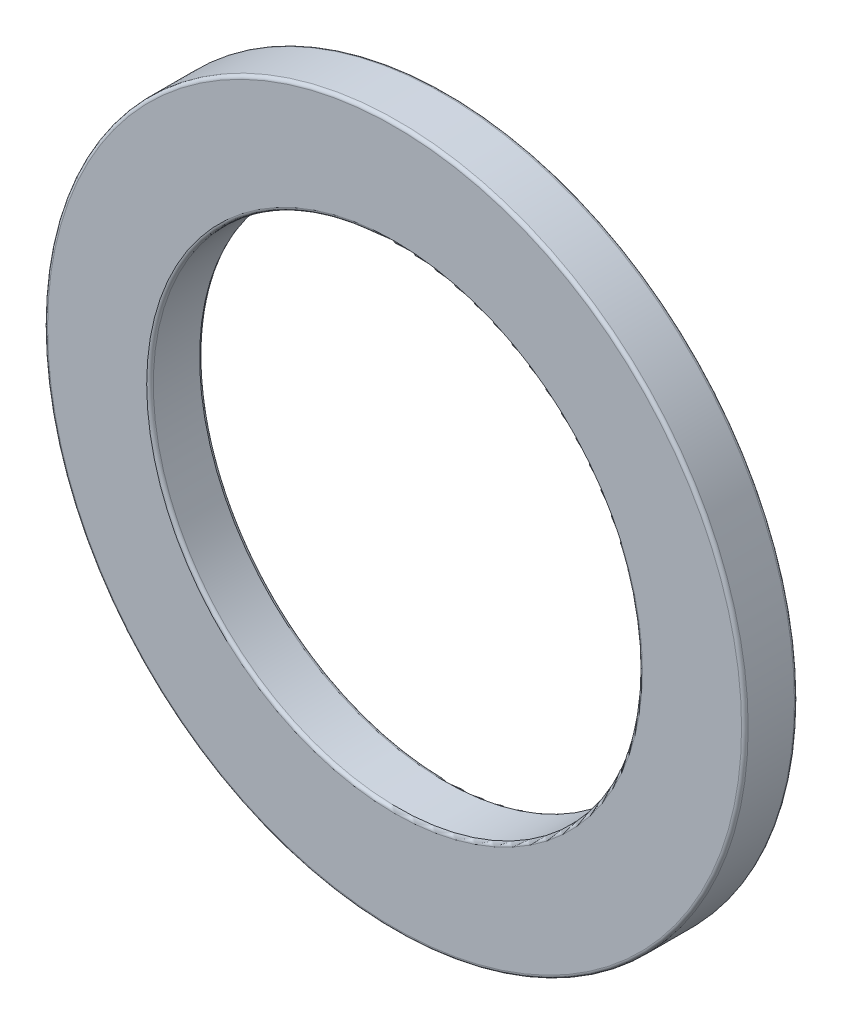
ISO-10303-21;
HEADER;
FILE_DESCRIPTION(('STEP AP214'),'2;1');
FILE_NAME('part.step','',(''),(''),'','','');
FILE_SCHEMA(('AUTOMOTIVE_DESIGN { 1 0 10303 214 1 1 1 1 }'));
ENDSEC;
DATA;
#1=APPLICATION_CONTEXT('core data for automotive mechanical design processes');
#2=APPLICATION_PROTOCOL_DEFINITION('international standard','automotive_design',2000,#1);
#3=PRODUCT_CONTEXT('',#1,'mechanical');
#4=PRODUCT('Part','Part','',(#3));
#5=PRODUCT_RELATED_PRODUCT_CATEGORY('part','',(#4));
#6=PRODUCT_DEFINITION_FORMATION('','',#4);
#7=PRODUCT_DEFINITION_CONTEXT('part definition',#1,'design');
#8=PRODUCT_DEFINITION('design','',#6,#7);
#9=PRODUCT_DEFINITION_SHAPE('','',#8);
#10=(LENGTH_UNIT() NAMED_UNIT(*) SI_UNIT(.MILLI.,.METRE.));
#11=(NAMED_UNIT(*) PLANE_ANGLE_UNIT() SI_UNIT($,.RADIAN.));
#12=(NAMED_UNIT(*) SI_UNIT($,.STERADIAN.) SOLID_ANGLE_UNIT());
#13=UNCERTAINTY_MEASURE_WITH_UNIT(LENGTH_MEASURE(1.E-05),#10,'distance_accuracy_value','');
#14=(GEOMETRIC_REPRESENTATION_CONTEXT(3) GLOBAL_UNCERTAINTY_ASSIGNED_CONTEXT((#13)) GLOBAL_UNIT_ASSIGNED_CONTEXT((#10,
#11,#12)) REPRESENTATION_CONTEXT('',''));
#15=CARTESIAN_POINT('',(0.,0.,0.));
#16=DIRECTION('',(0.,0.,1.));
#17=DIRECTION('',(1.,0.,0.));
#18=AXIS2_PLACEMENT_3D('',#15,#16,#17);
#19=CARTESIAN_POINT('',(0.,0.,8.));
#20=DIRECTION('',(0.,0.,1.));
#21=DIRECTION('',(1.,0.,0.));
#22=AXIS2_PLACEMENT_3D('',#19,#20,#21);
#23=PLANE('',#22);
#24=CARTESIAN_POINT('',(0.,0.,8.));
#25=DIRECTION('',(0.,0.,1.));
#26=DIRECTION('',(1.,0.,0.));
#27=AXIS2_PLACEMENT_3D('',#24,#25,#26);
#28=CIRCLE('',#27,37.5);
#29=CARTESIAN_POINT('',(37.5,0.,8.));
#30=VERTEX_POINT('',#29);
#31=EDGE_CURVE('E46',#30,#30,#28,.F.);
#32=ORIENTED_EDGE('',*,*,#31,.T.);
#33=EDGE_LOOP('',(#32));
#34=FACE_BOUND('',#33,.T.);
#35=CARTESIAN_POINT('',(0.,0.,8.));
#36=DIRECTION('',(0.,0.,1.));
#37=DIRECTION('',(1.,0.,0.));
#38=AXIS2_PLACEMENT_3D('',#35,#36,#37);
#39=CIRCLE('',#38,52.5);
#40=CARTESIAN_POINT('',(52.5,0.,8.));
#41=VERTEX_POINT('',#40);
#42=EDGE_CURVE('E50',#41,#41,#39,.T.);
#43=ORIENTED_EDGE('',*,*,#42,.T.);
#44=EDGE_LOOP('',(#43));
#45=FACE_BOUND('',#44,.T.);
#46=ADVANCED_FACE('F35',(#34,#45),#23,.T.);
#47=CARTESIAN_POINT('',(0.,0.,0.));
#48=DIRECTION('',(0.,0.,1.));
#49=DIRECTION('',(1.,0.,0.));
#50=AXIS2_PLACEMENT_3D('',#47,#48,#49);
#51=PLANE('',#50);
#52=CARTESIAN_POINT('',(0.,0.,0.));
#53=DIRECTION('',(0.,0.,1.));
#54=DIRECTION('',(1.,0.,0.));
#55=AXIS2_PLACEMENT_3D('',#52,#53,#54);
#56=CIRCLE('',#55,37.5);
#57=CARTESIAN_POINT('',(37.5,0.,0.));
#58=VERTEX_POINT('',#57);
#59=EDGE_CURVE('E61',#58,#58,#56,.T.);
#60=ORIENTED_EDGE('',*,*,#59,.T.);
#61=EDGE_LOOP('',(#60));
#62=FACE_BOUND('',#61,.T.);
#63=CARTESIAN_POINT('',(0.,0.,0.));
#64=DIRECTION('',(0.,0.,1.));
#65=DIRECTION('',(1.,0.,0.));
#66=AXIS2_PLACEMENT_3D('',#63,#64,#65);
#67=CIRCLE('',#66,52.5);
#68=CARTESIAN_POINT('',(52.5,0.,0.));
#69=VERTEX_POINT('',#68);
#70=EDGE_CURVE('E64',#69,#69,#67,.F.);
#71=ORIENTED_EDGE('',*,*,#70,.T.);
#72=EDGE_LOOP('',(#71));
#73=FACE_BOUND('',#72,.T.);
#74=ADVANCED_FACE('F68',(#62,#73),#51,.F.);
#75=CARTESIAN_POINT('',(0.,0.,8.));
#76=DIRECTION('',(0.,0.,-1.));
#77=DIRECTION('',(-1.,0.,0.));
#78=AXIS2_PLACEMENT_3D('',#75,#76,#77);
#79=CYLINDRICAL_SURFACE('',#78,53.);
#80=CARTESIAN_POINT('',(0.,0.,0.5));
#81=DIRECTION('',(0.,0.,1.));
#82=DIRECTION('',(1.,0.,0.));
#83=AXIS2_PLACEMENT_3D('',#80,#81,#82);
#84=CIRCLE('',#83,53.);
#85=CARTESIAN_POINT('',(53.,0.,0.5));
#86=VERTEX_POINT('',#85);
#87=EDGE_CURVE('E10',#86,#86,#84,.T.);
#88=ORIENTED_EDGE('',*,*,#87,.T.);
#89=EDGE_LOOP('',(#88));
#90=FACE_BOUND('',#89,.T.);
#91=CARTESIAN_POINT('',(0.,0.,7.5));
#92=DIRECTION('',(0.,0.,1.));
#93=DIRECTION('',(1.,0.,0.));
#94=AXIS2_PLACEMENT_3D('',#91,#92,#93);
#95=CIRCLE('',#94,53.);
#96=CARTESIAN_POINT('',(53.,0.,7.5));
#97=VERTEX_POINT('',#96);
#98=EDGE_CURVE('E42',#97,#97,#95,.F.);
#99=ORIENTED_EDGE('',*,*,#98,.T.);
#100=EDGE_LOOP('',(#99));
#101=FACE_BOUND('',#100,.T.);
#102=ADVANCED_FACE('F88',(#90,#101),#79,.T.);
#103=CARTESIAN_POINT('',(0.,0.,8.));
#104=DIRECTION('',(0.,0.,-1.));
#105=DIRECTION('',(-1.,0.,0.));
#106=AXIS2_PLACEMENT_3D('',#103,#104,#105);
#107=CYLINDRICAL_SURFACE('',#106,37.);
#108=CARTESIAN_POINT('',(0.,0.,0.5));
#109=DIRECTION('',(0.,0.,1.));
#110=DIRECTION('',(1.,0.,0.));
#111=AXIS2_PLACEMENT_3D('',#108,#109,#110);
#112=CIRCLE('',#111,37.);
#113=CARTESIAN_POINT('',(37.,0.,0.5));
#114=VERTEX_POINT('',#113);
#115=EDGE_CURVE('E55',#114,#114,#112,.F.);
#116=ORIENTED_EDGE('',*,*,#115,.T.);
#117=EDGE_LOOP('',(#116));
#118=FACE_BOUND('',#117,.T.);
#119=CARTESIAN_POINT('',(0.,0.,7.5));
#120=DIRECTION('',(0.,0.,1.));
#121=DIRECTION('',(1.,0.,0.));
#122=AXIS2_PLACEMENT_3D('',#119,#120,#121);
#123=CIRCLE('',#122,37.);
#124=CARTESIAN_POINT('',(37.,0.,7.5));
#125=VERTEX_POINT('',#124);
#126=EDGE_CURVE('E58',#125,#125,#123,.T.);
#127=ORIENTED_EDGE('',*,*,#126,.T.);
#128=EDGE_LOOP('',(#127));
#129=FACE_BOUND('',#128,.T.);
#130=ADVANCED_FACE('F93',(#118,#129),#107,.F.);
#131=CARTESIAN_POINT('',(0.,0.,0.5));
#132=DIRECTION('',(0.,0.,1.));
#133=DIRECTION('',(1.,0.,0.));
#134=AXIS2_PLACEMENT_3D('',#131,#132,#133);
#135=TOROIDAL_SURFACE('',#134,37.5,0.5);
#136=ORIENTED_EDGE('',*,*,#115,.F.);
#137=EDGE_LOOP('',(#136));
#138=FACE_BOUND('',#137,.T.);
#139=ORIENTED_EDGE('',*,*,#59,.F.);
#140=EDGE_LOOP('',(#139));
#141=FACE_BOUND('',#140,.T.);
#142=ADVANCED_FACE('F79',(#138,#141),#135,.T.);
#143=CARTESIAN_POINT('',(0.,0.,7.5));
#144=DIRECTION('',(0.,0.,1.));
#145=DIRECTION('',(1.,0.,0.));
#146=AXIS2_PLACEMENT_3D('',#143,#144,#145);
#147=TOROIDAL_SURFACE('',#146,37.5,0.5);
#148=ORIENTED_EDGE('',*,*,#31,.F.);
#149=EDGE_LOOP('',(#148));
#150=FACE_BOUND('',#149,.T.);
#151=ORIENTED_EDGE('',*,*,#126,.F.);
#152=EDGE_LOOP('',(#151));
#153=FACE_BOUND('',#152,.T.);
#154=ADVANCED_FACE('F73',(#150,#153),#147,.T.);
#155=CARTESIAN_POINT('',(0.,0.,0.5));
#156=DIRECTION('',(0.,0.,1.));
#157=DIRECTION('',(1.,0.,0.));
#158=AXIS2_PLACEMENT_3D('',#155,#156,#157);
#159=TOROIDAL_SURFACE('',#158,52.5,0.5);
#160=ORIENTED_EDGE('',*,*,#70,.F.);
#161=EDGE_LOOP('',(#160));
#162=FACE_BOUND('',#161,.T.);
#163=ORIENTED_EDGE('',*,*,#87,.F.);
#164=EDGE_LOOP('',(#163));
#165=FACE_BOUND('',#164,.T.);
#166=ADVANCED_FACE('F70',(#162,#165),#159,.T.);
#167=CARTESIAN_POINT('',(0.,0.,7.5));
#168=DIRECTION('',(0.,0.,1.));
#169=DIRECTION('',(1.,0.,0.));
#170=AXIS2_PLACEMENT_3D('',#167,#168,#169);
#171=TOROIDAL_SURFACE('',#170,52.5,0.5);
#172=ORIENTED_EDGE('',*,*,#98,.F.);
#173=EDGE_LOOP('',(#172));
#174=FACE_BOUND('',#173,.T.);
#175=ORIENTED_EDGE('',*,*,#42,.F.);
#176=EDGE_LOOP('',(#175));
#177=FACE_BOUND('',#176,.T.);
#178=ADVANCED_FACE('F37',(#174,#177),#171,.T.);
#179=CLOSED_SHELL('',(#46,#74,#102,#130,#142,#154,#166,#178));
#180=MANIFOLD_SOLID_BREP('B2',#179);
#181=ADVANCED_BREP_SHAPE_REPRESENTATION('',(#18,#180),#14);
#182=SHAPE_DEFINITION_REPRESENTATION(#9,#181);
ENDSEC;
END-ISO-10303-21;
